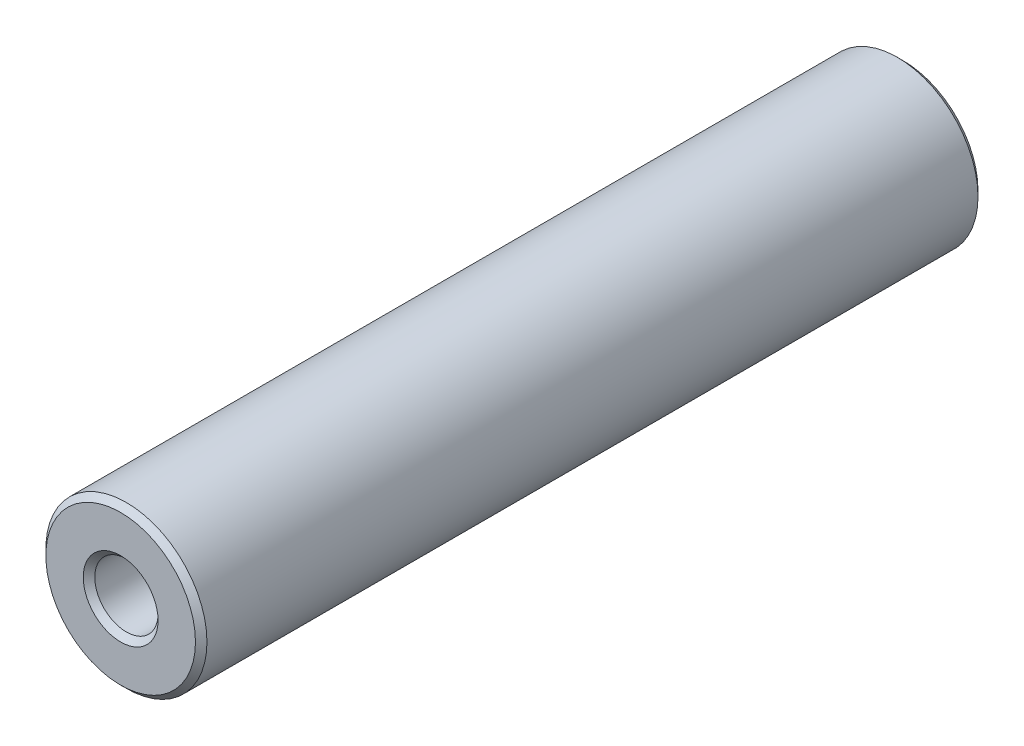
ISO-10303-21;
HEADER;
FILE_DESCRIPTION(('STEP AP214'),'2;1');
FILE_NAME('part.step','',(''),(''),'','','');
FILE_SCHEMA(('AUTOMOTIVE_DESIGN { 1 0 10303 214 1 1 1 1 }'));
ENDSEC;
DATA;
#1=APPLICATION_CONTEXT('core data for automotive mechanical design processes');
#2=APPLICATION_PROTOCOL_DEFINITION('international standard','automotive_design',2000,#1);
#3=PRODUCT_CONTEXT('',#1,'mechanical');
#4=PRODUCT('Part','Part','',(#3));
#5=PRODUCT_RELATED_PRODUCT_CATEGORY('part','',(#4));
#6=PRODUCT_DEFINITION_FORMATION('','',#4);
#7=PRODUCT_DEFINITION_CONTEXT('part definition',#1,'design');
#8=PRODUCT_DEFINITION('design','',#6,#7);
#9=PRODUCT_DEFINITION_SHAPE('','',#8);
#10=(LENGTH_UNIT() NAMED_UNIT(*) SI_UNIT(.MILLI.,.METRE.));
#11=(NAMED_UNIT(*) PLANE_ANGLE_UNIT() SI_UNIT($,.RADIAN.));
#12=(NAMED_UNIT(*) SI_UNIT($,.STERADIAN.) SOLID_ANGLE_UNIT());
#13=UNCERTAINTY_MEASURE_WITH_UNIT(LENGTH_MEASURE(1.E-05),#10,'distance_accuracy_value','');
#14=(GEOMETRIC_REPRESENTATION_CONTEXT(3) GLOBAL_UNCERTAINTY_ASSIGNED_CONTEXT((#13)) GLOBAL_UNIT_ASSIGNED_CONTEXT((#10,
#11,#12)) REPRESENTATION_CONTEXT('',''));
#15=CARTESIAN_POINT('',(0.,0.,0.));
#16=DIRECTION('',(0.,0.,1.));
#17=DIRECTION('',(1.,0.,0.));
#18=AXIS2_PLACEMENT_3D('',#15,#16,#17);
#19=CARTESIAN_POINT('',(0.,0.,34.));
#20=DIRECTION('',(0.,0.,1.));
#21=DIRECTION('',(1.,0.,0.));
#22=AXIS2_PLACEMENT_3D('',#19,#20,#21);
#23=PLANE('',#22);
#24=CARTESIAN_POINT('',(0.,0.,34.));
#25=DIRECTION('',(0.,0.,1.));
#26=DIRECTION('',(1.,0.,0.));
#27=AXIS2_PLACEMENT_3D('',#24,#25,#26);
#28=CIRCLE('',#27,6.5);
#29=CARTESIAN_POINT('',(6.5,0.,34.));
#30=VERTEX_POINT('',#29);
#31=EDGE_CURVE('E10',#30,#30,#28,.T.);
#32=ORIENTED_EDGE('',*,*,#31,.T.);
#33=EDGE_LOOP('',(#32));
#34=FACE_BOUND('',#33,.T.);
#35=CARTESIAN_POINT('',(0.,0.,34.));
#36=DIRECTION('',(0.,0.,1.));
#37=DIRECTION('',(1.,0.,0.));
#38=AXIS2_PLACEMENT_3D('',#35,#36,#37);
#39=CIRCLE('',#38,3.25000000000002);
#40=CARTESIAN_POINT('',(3.25000000000002,0.,34.));
#41=VERTEX_POINT('',#40);
#42=EDGE_CURVE('E65',#41,#41,#39,.F.);
#43=ORIENTED_EDGE('',*,*,#42,.T.);
#44=EDGE_LOOP('',(#43));
#45=FACE_BOUND('',#44,.T.);
#46=ADVANCED_FACE('F41',(#34,#45),#23,.T.);
#47=CARTESIAN_POINT('',(0.,0.,-34.));
#48=DIRECTION('',(0.,0.,1.));
#49=DIRECTION('',(1.,0.,0.));
#50=AXIS2_PLACEMENT_3D('',#47,#48,#49);
#51=PLANE('',#50);
#52=CARTESIAN_POINT('',(0.,0.,-34.));
#53=DIRECTION('',(0.,0.,1.));
#54=DIRECTION('',(1.,0.,0.));
#55=AXIS2_PLACEMENT_3D('',#52,#53,#54);
#56=CIRCLE('',#55,6.50000000000001);
#57=CARTESIAN_POINT('',(6.50000000000001,0.,-34.));
#58=VERTEX_POINT('',#57);
#59=EDGE_CURVE('E47',#58,#58,#56,.F.);
#60=ORIENTED_EDGE('',*,*,#59,.T.);
#61=EDGE_LOOP('',(#60));
#62=FACE_BOUND('',#61,.T.);
#63=CARTESIAN_POINT('',(0.,0.,-34.));
#64=DIRECTION('',(0.,0.,1.));
#65=DIRECTION('',(1.,0.,0.));
#66=AXIS2_PLACEMENT_3D('',#63,#64,#65);
#67=CIRCLE('',#66,3.25);
#68=CARTESIAN_POINT('',(3.25,0.,-34.));
#69=VERTEX_POINT('',#68);
#70=EDGE_CURVE('E74',#69,#69,#67,.T.);
#71=ORIENTED_EDGE('',*,*,#70,.T.);
#72=EDGE_LOOP('',(#71));
#73=FACE_BOUND('',#72,.T.);
#74=ADVANCED_FACE('F72',(#62,#73),#51,.F.);
#75=CARTESIAN_POINT('',(0.,0.,34.));
#76=DIRECTION('',(0.,0.,-1.));
#77=DIRECTION('',(-1.,0.,0.));
#78=AXIS2_PLACEMENT_3D('',#75,#76,#77);
#79=CYLINDRICAL_SURFACE('',#78,7.);
#80=CARTESIAN_POINT('',(0.,0.,-33.5));
#81=DIRECTION('',(0.,0.,1.));
#82=DIRECTION('',(1.,0.,0.));
#83=AXIS2_PLACEMENT_3D('',#80,#81,#82);
#84=CIRCLE('',#83,7.);
#85=CARTESIAN_POINT('',(7.,0.,-33.5));
#86=VERTEX_POINT('',#85);
#87=EDGE_CURVE('E52',#86,#86,#84,.T.);
#88=ORIENTED_EDGE('',*,*,#87,.T.);
#89=EDGE_LOOP('',(#88));
#90=FACE_BOUND('',#89,.T.);
#91=CARTESIAN_POINT('',(0.,0.,33.5));
#92=DIRECTION('',(0.,0.,1.));
#93=DIRECTION('',(1.,0.,0.));
#94=AXIS2_PLACEMENT_3D('',#91,#92,#93);
#95=CIRCLE('',#94,7.);
#96=CARTESIAN_POINT('',(7.,0.,33.5));
#97=VERTEX_POINT('',#96);
#98=EDGE_CURVE('E60',#97,#97,#95,.F.);
#99=ORIENTED_EDGE('',*,*,#98,.T.);
#100=EDGE_LOOP('',(#99));
#101=FACE_BOUND('',#100,.T.);
#102=ADVANCED_FACE('F90',(#90,#101),#79,.T.);
#103=CARTESIAN_POINT('',(0.,0.,34.));
#104=DIRECTION('',(0.,0.,-1.));
#105=DIRECTION('',(-1.,0.,0.));
#106=AXIS2_PLACEMENT_3D('',#103,#104,#105);
#107=CYLINDRICAL_SURFACE('',#106,2.75);
#108=CARTESIAN_POINT('',(0.,0.,-33.5));
#109=DIRECTION('',(0.,0.,1.));
#110=DIRECTION('',(1.,0.,0.));
#111=AXIS2_PLACEMENT_3D('',#108,#109,#110);
#112=CIRCLE('',#111,2.75);
#113=CARTESIAN_POINT('',(2.75,0.,-33.5));
#114=VERTEX_POINT('',#113);
#115=EDGE_CURVE('E63',#114,#114,#112,.F.);
#116=ORIENTED_EDGE('',*,*,#115,.T.);
#117=EDGE_LOOP('',(#116));
#118=FACE_BOUND('',#117,.T.);
#119=CARTESIAN_POINT('',(0.,0.,33.5));
#120=DIRECTION('',(0.,0.,1.));
#121=DIRECTION('',(1.,0.,0.));
#122=AXIS2_PLACEMENT_3D('',#119,#120,#121);
#123=CIRCLE('',#122,2.75);
#124=CARTESIAN_POINT('',(2.75,0.,33.5));
#125=VERTEX_POINT('',#124);
#126=EDGE_CURVE('E69',#125,#125,#123,.T.);
#127=ORIENTED_EDGE('',*,*,#126,.T.);
#128=EDGE_LOOP('',(#127));
#129=FACE_BOUND('',#128,.T.);
#130=ADVANCED_FACE('F78',(#118,#129),#107,.F.);
#131=CARTESIAN_POINT('',(0.,0.,-34.));
#132=DIRECTION('',(0.,0.,-1.));
#133=DIRECTION('',(-1.,0.,0.));
#134=AXIS2_PLACEMENT_3D('',#131,#132,#133);
#135=CONICAL_SURFACE('',#134,3.25,0.785398163397451);
#136=ORIENTED_EDGE('',*,*,#115,.F.);
#137=EDGE_LOOP('',(#136));
#138=FACE_BOUND('',#137,.T.);
#139=ORIENTED_EDGE('',*,*,#70,.F.);
#140=EDGE_LOOP('',(#139));
#141=FACE_BOUND('',#140,.T.);
#142=ADVANCED_FACE('F80',(#138,#141),#135,.F.);
#143=CARTESIAN_POINT('',(0.,0.,33.5));
#144=DIRECTION('',(0.,0.,1.));
#145=DIRECTION('',(1.,0.,0.));
#146=AXIS2_PLACEMENT_3D('',#143,#144,#145);
#147=CONICAL_SURFACE('',#146,2.75,0.785398163397451);
#148=ORIENTED_EDGE('',*,*,#42,.F.);
#149=EDGE_LOOP('',(#148));
#150=FACE_BOUND('',#149,.T.);
#151=ORIENTED_EDGE('',*,*,#126,.F.);
#152=EDGE_LOOP('',(#151));
#153=FACE_BOUND('',#152,.T.);
#154=ADVANCED_FACE('F79',(#150,#153),#147,.F.);
#155=CARTESIAN_POINT('',(0.,0.,-33.5));
#156=DIRECTION('',(0.,0.,1.));
#157=DIRECTION('',(1.,0.,0.));
#158=AXIS2_PLACEMENT_3D('',#155,#156,#157);
#159=CONICAL_SURFACE('',#158,7.,0.785398163397442);
#160=ORIENTED_EDGE('',*,*,#59,.F.);
#161=EDGE_LOOP('',(#160));
#162=FACE_BOUND('',#161,.T.);
#163=ORIENTED_EDGE('',*,*,#87,.F.);
#164=EDGE_LOOP('',(#163));
#165=FACE_BOUND('',#164,.T.);
#166=ADVANCED_FACE('F87',(#162,#165),#159,.T.);
#167=CARTESIAN_POINT('',(0.,0.,34.));
#168=DIRECTION('',(0.,0.,-1.));
#169=DIRECTION('',(-1.,0.,0.));
#170=AXIS2_PLACEMENT_3D('',#167,#168,#169);
#171=CONICAL_SURFACE('',#170,6.5,0.785398163397442);
#172=ORIENTED_EDGE('',*,*,#98,.F.);
#173=EDGE_LOOP('',(#172));
#174=FACE_BOUND('',#173,.T.);
#175=ORIENTED_EDGE('',*,*,#31,.F.);
#176=EDGE_LOOP('',(#175));
#177=FACE_BOUND('',#176,.T.);
#178=ADVANCED_FACE('F42',(#174,#177),#171,.T.);
#179=CLOSED_SHELL('',(#46,#74,#102,#130,#142,#154,#166,#178));
#180=MANIFOLD_SOLID_BREP('B2',#179);
#181=ADVANCED_BREP_SHAPE_REPRESENTATION('',(#18,#180),#14);
#182=SHAPE_DEFINITION_REPRESENTATION(#9,#181);
ENDSEC;
END-ISO-10303-21;
